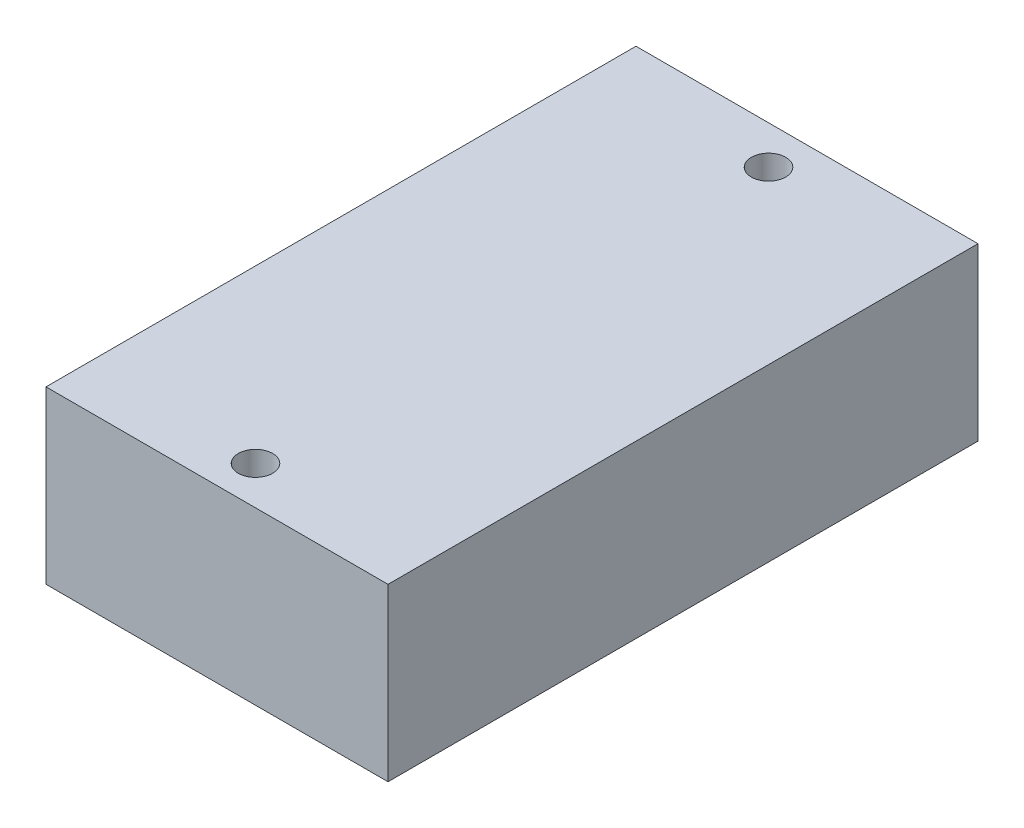
ISO-10303-21;
HEADER;
FILE_DESCRIPTION(('STEP AP214'),'2;1');
FILE_NAME('part.step','',(''),(''),'','','');
FILE_SCHEMA(('AUTOMOTIVE_DESIGN { 1 0 10303 214 1 1 1 1 }'));
ENDSEC;
DATA;
#1=APPLICATION_CONTEXT('core data for automotive mechanical design processes');
#2=APPLICATION_PROTOCOL_DEFINITION('international standard','automotive_design',2000,#1);
#3=PRODUCT_CONTEXT('',#1,'mechanical');
#4=PRODUCT('Part','Part','',(#3));
#5=PRODUCT_RELATED_PRODUCT_CATEGORY('part','',(#4));
#6=PRODUCT_DEFINITION_FORMATION('','',#4);
#7=PRODUCT_DEFINITION_CONTEXT('part definition',#1,'design');
#8=PRODUCT_DEFINITION('design','',#6,#7);
#9=PRODUCT_DEFINITION_SHAPE('','',#8);
#10=(LENGTH_UNIT() NAMED_UNIT(*) SI_UNIT(.MILLI.,.METRE.));
#11=(NAMED_UNIT(*) PLANE_ANGLE_UNIT() SI_UNIT($,.RADIAN.));
#12=(NAMED_UNIT(*) SI_UNIT($,.STERADIAN.) SOLID_ANGLE_UNIT());
#13=UNCERTAINTY_MEASURE_WITH_UNIT(LENGTH_MEASURE(1.E-05),#10,'distance_accuracy_value','');
#14=(GEOMETRIC_REPRESENTATION_CONTEXT(3) GLOBAL_UNCERTAINTY_ASSIGNED_CONTEXT((#13)) GLOBAL_UNIT_ASSIGNED_CONTEXT((#10,
#11,#12)) REPRESENTATION_CONTEXT('',''));
#15=CARTESIAN_POINT('',(0.,0.,0.));
#16=DIRECTION('',(0.,0.,1.));
#17=DIRECTION('',(1.,0.,0.));
#18=AXIS2_PLACEMENT_3D('',#15,#16,#17);
#19=CARTESIAN_POINT('',(25.4,25.4,-43.815));
#20=DIRECTION('',(-1.,0.,0.));
#21=DIRECTION('',(0.,0.,1.));
#22=AXIS2_PLACEMENT_3D('',#19,#20,#21);
#23=PLANE('',#22);
#24=DIRECTION('',(0.,0.,-1.));
#25=VECTOR('',#24,1.);
#26=CARTESIAN_POINT('',(25.4,0.,-43.815));
#27=LINE('',#26,#25);
#28=CARTESIAN_POINT('',(25.4,0.,43.815));
#29=VERTEX_POINT('',#28);
#30=CARTESIAN_POINT('',(25.4,0.,-43.815));
#31=VERTEX_POINT('',#30);
#32=EDGE_CURVE('E104',#29,#31,#27,.T.);
#33=ORIENTED_EDGE('',*,*,#32,.T.);
#34=DIRECTION('',(0.,-1.,0.));
#35=VECTOR('',#34,1.);
#36=CARTESIAN_POINT('',(25.4,25.4,-43.815));
#37=LINE('',#36,#35);
#38=CARTESIAN_POINT('',(25.4,25.4,-43.815));
#39=VERTEX_POINT('',#38);
#40=EDGE_CURVE('E11',#39,#31,#37,.T.);
#41=ORIENTED_EDGE('',*,*,#40,.F.);
#42=DIRECTION('',(0.,0.,-1.));
#43=VECTOR('',#42,1.);
#44=CARTESIAN_POINT('',(25.4,25.4,-43.815));
#45=LINE('',#44,#43);
#46=CARTESIAN_POINT('',(25.4,25.4,43.815));
#47=VERTEX_POINT('',#46);
#48=EDGE_CURVE('E92',#47,#39,#45,.T.);
#49=ORIENTED_EDGE('',*,*,#48,.F.);
#50=DIRECTION('',(0.,-1.,0.));
#51=VECTOR('',#50,1.);
#52=CARTESIAN_POINT('',(25.4,25.4,43.815));
#53=LINE('',#52,#51);
#54=EDGE_CURVE('E100',#47,#29,#53,.T.);
#55=ORIENTED_EDGE('',*,*,#54,.T.);
#56=EDGE_LOOP('',(#33,#41,#49,#55));
#57=FACE_BOUND('',#56,.T.);
#58=ADVANCED_FACE('F41',(#57),#23,.F.);
#59=CARTESIAN_POINT('',(-25.4,25.4,-43.815));
#60=DIRECTION('',(0.,0.,1.));
#61=DIRECTION('',(1.,0.,0.));
#62=AXIS2_PLACEMENT_3D('',#59,#60,#61);
#63=PLANE('',#62);
#64=DIRECTION('',(-1.,0.,0.));
#65=VECTOR('',#64,1.);
#66=CARTESIAN_POINT('',(-25.4,0.,-43.815));
#67=LINE('',#66,#65);
#68=CARTESIAN_POINT('',(-25.4,0.,-43.815));
#69=VERTEX_POINT('',#68);
#70=EDGE_CURVE('E96',#31,#69,#67,.T.);
#71=ORIENTED_EDGE('',*,*,#70,.T.);
#72=DIRECTION('',(0.,-1.,0.));
#73=VECTOR('',#72,1.);
#74=CARTESIAN_POINT('',(-25.4,25.4,-43.815));
#75=LINE('',#74,#73);
#76=CARTESIAN_POINT('',(-25.4,25.4,-43.815));
#77=VERTEX_POINT('',#76);
#78=EDGE_CURVE('E49',#77,#69,#75,.T.);
#79=ORIENTED_EDGE('',*,*,#78,.F.);
#80=DIRECTION('',(-1.,0.,0.));
#81=VECTOR('',#80,1.);
#82=CARTESIAN_POINT('',(-25.4,25.4,-43.815));
#83=LINE('',#82,#81);
#84=EDGE_CURVE('E87',#39,#77,#83,.T.);
#85=ORIENTED_EDGE('',*,*,#84,.F.);
#86=ORIENTED_EDGE('',*,*,#40,.T.);
#87=EDGE_LOOP('',(#71,#79,#85,#86));
#88=FACE_BOUND('',#87,.T.);
#89=ADVANCED_FACE('F95',(#88),#63,.F.);
#90=CARTESIAN_POINT('',(-25.4,25.4,-43.815));
#91=DIRECTION('',(1.,0.,0.));
#92=DIRECTION('',(0.,0.,-1.));
#93=AXIS2_PLACEMENT_3D('',#90,#91,#92);
#94=PLANE('',#93);
#95=DIRECTION('',(0.,0.,1.));
#96=VECTOR('',#95,1.);
#97=CARTESIAN_POINT('',(-25.4,0.,-43.815));
#98=LINE('',#97,#96);
#99=CARTESIAN_POINT('',(-25.4,0.,43.815));
#100=VERTEX_POINT('',#99);
#101=EDGE_CURVE('E74',#69,#100,#98,.T.);
#102=ORIENTED_EDGE('',*,*,#101,.T.);
#103=DIRECTION('',(0.,-1.,0.));
#104=VECTOR('',#103,1.);
#105=CARTESIAN_POINT('',(-25.4,25.4,43.815));
#106=LINE('',#105,#104);
#107=CARTESIAN_POINT('',(-25.4,25.4,43.815));
#108=VERTEX_POINT('',#107);
#109=EDGE_CURVE('E97',#108,#100,#106,.T.);
#110=ORIENTED_EDGE('',*,*,#109,.F.);
#111=DIRECTION('',(0.,0.,1.));
#112=VECTOR('',#111,1.);
#113=CARTESIAN_POINT('',(-25.4,25.4,-43.815));
#114=LINE('',#113,#112);
#115=EDGE_CURVE('E90',#77,#108,#114,.T.);
#116=ORIENTED_EDGE('',*,*,#115,.F.);
#117=ORIENTED_EDGE('',*,*,#78,.T.);
#118=EDGE_LOOP('',(#102,#110,#116,#117));
#119=FACE_BOUND('',#118,.T.);
#120=ADVANCED_FACE('F98',(#119),#94,.F.);
#121=CARTESIAN_POINT('',(-25.4,25.4,43.815));
#122=DIRECTION('',(0.,0.,-1.));
#123=DIRECTION('',(-1.,0.,0.));
#124=AXIS2_PLACEMENT_3D('',#121,#122,#123);
#125=PLANE('',#124);
#126=DIRECTION('',(1.,0.,0.));
#127=VECTOR('',#126,1.);
#128=CARTESIAN_POINT('',(-25.4,0.,43.815));
#129=LINE('',#128,#127);
#130=EDGE_CURVE('E80',#100,#29,#129,.T.);
#131=ORIENTED_EDGE('',*,*,#130,.T.);
#132=ORIENTED_EDGE('',*,*,#54,.F.);
#133=DIRECTION('',(1.,0.,0.));
#134=VECTOR('',#133,1.);
#135=CARTESIAN_POINT('',(-25.4,25.4,43.815));
#136=LINE('',#135,#134);
#137=EDGE_CURVE('E57',#108,#47,#136,.T.);
#138=ORIENTED_EDGE('',*,*,#137,.F.);
#139=ORIENTED_EDGE('',*,*,#109,.T.);
#140=EDGE_LOOP('',(#131,#132,#138,#139));
#141=FACE_BOUND('',#140,.T.);
#142=ADVANCED_FACE('F112',(#141),#125,.F.);
#143=CARTESIAN_POINT('',(0.,25.4,0.));
#144=DIRECTION('',(0.,1.,0.));
#145=DIRECTION('',(0.,0.,1.));
#146=AXIS2_PLACEMENT_3D('',#143,#144,#145);
#147=PLANE('',#146);
#148=CARTESIAN_POINT('',(0.,25.4,-38.1));
#149=DIRECTION('',(0.,1.,0.));
#150=DIRECTION('',(0.,0.,1.));
#151=AXIS2_PLACEMENT_3D('',#148,#149,#150);
#152=CIRCLE('',#151,2.5527);
#153=CARTESIAN_POINT('',(0.,25.4,-35.5473));
#154=VERTEX_POINT('',#153);
#155=EDGE_CURVE('E126',#154,#154,#152,.T.);
#156=ORIENTED_EDGE('',*,*,#155,.F.);
#157=EDGE_LOOP('',(#156));
#158=FACE_BOUND('',#157,.T.);
#159=CARTESIAN_POINT('',(0.,25.4,38.1));
#160=DIRECTION('',(0.,1.,0.));
#161=DIRECTION('',(0.,0.,1.));
#162=AXIS2_PLACEMENT_3D('',#159,#160,#161);
#163=CIRCLE('',#162,2.5527);
#164=CARTESIAN_POINT('',(0.,25.4,40.6527));
#165=VERTEX_POINT('',#164);
#166=EDGE_CURVE('E120',#165,#165,#163,.T.);
#167=ORIENTED_EDGE('',*,*,#166,.F.);
#168=EDGE_LOOP('',(#167));
#169=FACE_BOUND('',#168,.T.);
#170=ORIENTED_EDGE('',*,*,#48,.T.);
#171=ORIENTED_EDGE('',*,*,#84,.T.);
#172=ORIENTED_EDGE('',*,*,#115,.T.);
#173=ORIENTED_EDGE('',*,*,#137,.T.);
#174=EDGE_LOOP('',(#170,#171,#172,#173));
#175=FACE_BOUND('',#174,.T.);
#176=ADVANCED_FACE('F88',(#158,#169,#175),#147,.T.);
#177=CARTESIAN_POINT('',(0.,0.,0.));
#178=DIRECTION('',(0.,1.,0.));
#179=DIRECTION('',(0.,0.,1.));
#180=AXIS2_PLACEMENT_3D('',#177,#178,#179);
#181=PLANE('',#180);
#182=CARTESIAN_POINT('',(0.,0.,-38.1));
#183=DIRECTION('',(0.,1.,0.));
#184=DIRECTION('',(0.,0.,1.));
#185=AXIS2_PLACEMENT_3D('',#182,#183,#184);
#186=CIRCLE('',#185,2.55269999999999);
#187=CARTESIAN_POINT('',(0.,0.,-35.5473));
#188=VERTEX_POINT('',#187);
#189=EDGE_CURVE('E123',#188,#188,#186,.T.);
#190=ORIENTED_EDGE('',*,*,#189,.T.);
#191=EDGE_LOOP('',(#190));
#192=FACE_BOUND('',#191,.T.);
#193=CARTESIAN_POINT('',(0.,0.,38.1));
#194=DIRECTION('',(0.,1.,0.));
#195=DIRECTION('',(0.,0.,1.));
#196=AXIS2_PLACEMENT_3D('',#193,#194,#195);
#197=CIRCLE('',#196,2.55269999999999);
#198=CARTESIAN_POINT('',(0.,0.,40.6527));
#199=VERTEX_POINT('',#198);
#200=EDGE_CURVE('E107',#199,#199,#197,.T.);
#201=ORIENTED_EDGE('',*,*,#200,.T.);
#202=EDGE_LOOP('',(#201));
#203=FACE_BOUND('',#202,.T.);
#204=ORIENTED_EDGE('',*,*,#32,.F.);
#205=ORIENTED_EDGE('',*,*,#130,.F.);
#206=ORIENTED_EDGE('',*,*,#101,.F.);
#207=ORIENTED_EDGE('',*,*,#70,.F.);
#208=EDGE_LOOP('',(#204,#205,#206,#207));
#209=FACE_BOUND('',#208,.T.);
#210=ADVANCED_FACE('F115',(#192,#203,#209),#181,.F.);
#211=CARTESIAN_POINT('',(0.,25.4,38.1));
#212=DIRECTION('',(0.,1.,0.));
#213=DIRECTION('',(0.,0.,1.));
#214=AXIS2_PLACEMENT_3D('',#211,#212,#213);
#215=CYLINDRICAL_SURFACE('',#214,2.5527);
#216=ORIENTED_EDGE('',*,*,#200,.F.);
#217=EDGE_LOOP('',(#216));
#218=FACE_BOUND('',#217,.T.);
#219=ORIENTED_EDGE('',*,*,#166,.T.);
#220=EDGE_LOOP('',(#219));
#221=FACE_BOUND('',#220,.T.);
#222=ADVANCED_FACE('F137',(#218,#221),#215,.F.);
#223=CARTESIAN_POINT('',(0.,25.4,-38.1));
#224=DIRECTION('',(0.,1.,0.));
#225=DIRECTION('',(0.,0.,1.));
#226=AXIS2_PLACEMENT_3D('',#223,#224,#225);
#227=CYLINDRICAL_SURFACE('',#226,2.5527);
#228=ORIENTED_EDGE('',*,*,#189,.F.);
#229=EDGE_LOOP('',(#228));
#230=FACE_BOUND('',#229,.T.);
#231=ORIENTED_EDGE('',*,*,#155,.T.);
#232=EDGE_LOOP('',(#231));
#233=FACE_BOUND('',#232,.T.);
#234=ADVANCED_FACE('F130',(#230,#233),#227,.F.);
#235=CLOSED_SHELL('',(#58,#89,#120,#142,#176,#210,#222,#234));
#236=MANIFOLD_SOLID_BREP('B2',#235);
#237=ADVANCED_BREP_SHAPE_REPRESENTATION('',(#18,#236),#14);
#238=SHAPE_DEFINITION_REPRESENTATION(#9,#237);
ENDSEC;
END-ISO-10303-21;
